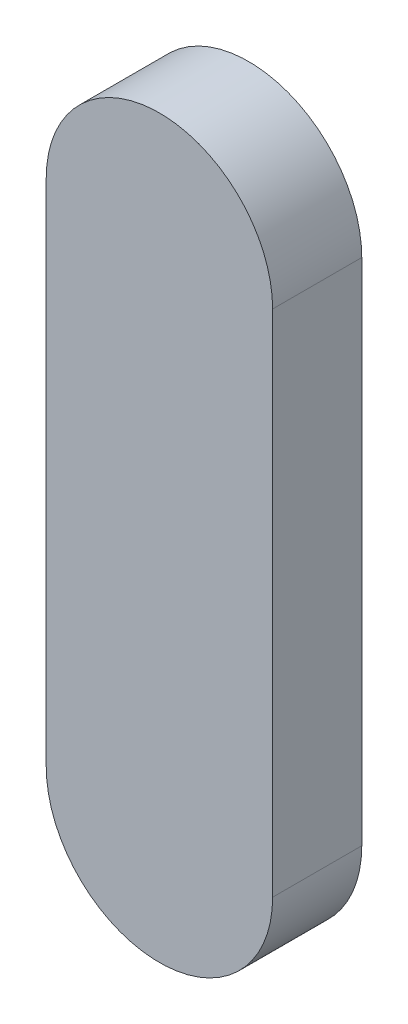
ISO-10303-21;
HEADER;
FILE_DESCRIPTION(('STEP AP214'),'2;1');
FILE_NAME('part.step','',(''),(''),'','','');
FILE_SCHEMA(('AUTOMOTIVE_DESIGN { 1 0 10303 214 1 1 1 1 }'));
ENDSEC;
DATA;
#1=APPLICATION_CONTEXT('core data for automotive mechanical design processes');
#2=APPLICATION_PROTOCOL_DEFINITION('international standard','automotive_design',2000,#1);
#3=PRODUCT_CONTEXT('',#1,'mechanical');
#4=PRODUCT('Part','Part','',(#3));
#5=PRODUCT_RELATED_PRODUCT_CATEGORY('part','',(#4));
#6=PRODUCT_DEFINITION_FORMATION('','',#4);
#7=PRODUCT_DEFINITION_CONTEXT('part definition',#1,'design');
#8=PRODUCT_DEFINITION('design','',#6,#7);
#9=PRODUCT_DEFINITION_SHAPE('','',#8);
#10=(LENGTH_UNIT() NAMED_UNIT(*) SI_UNIT(.MILLI.,.METRE.));
#11=(NAMED_UNIT(*) PLANE_ANGLE_UNIT() SI_UNIT($,.RADIAN.));
#12=(NAMED_UNIT(*) SI_UNIT($,.STERADIAN.) SOLID_ANGLE_UNIT());
#13=UNCERTAINTY_MEASURE_WITH_UNIT(LENGTH_MEASURE(1.E-05),#10,'distance_accuracy_value','');
#14=(GEOMETRIC_REPRESENTATION_CONTEXT(3) GLOBAL_UNCERTAINTY_ASSIGNED_CONTEXT((#13)) GLOBAL_UNIT_ASSIGNED_CONTEXT((#10,
#11,#12)) REPRESENTATION_CONTEXT('',''));
#15=CARTESIAN_POINT('',(0.,0.,0.));
#16=DIRECTION('',(0.,0.,1.));
#17=DIRECTION('',(1.,0.,0.));
#18=AXIS2_PLACEMENT_3D('',#15,#16,#17);
#19=CARTESIAN_POINT('',(138.684,54.864,0.));
#20=DIRECTION('',(-1.,0.,0.));
#21=DIRECTION('',(0.,1.,0.));
#22=AXIS2_PLACEMENT_3D('',#19,#20,#21);
#23=PLANE('',#22);
#24=DIRECTION('',(0.,1.,0.));
#25=VECTOR('',#24,1.);
#26=CARTESIAN_POINT('',(138.684,54.864,0.1999996));
#27=LINE('',#26,#25);
#28=CARTESIAN_POINT('',(138.684,54.864,0.1999996));
#29=VERTEX_POINT('',#28);
#30=CARTESIAN_POINT('',(138.684,56.007,0.1999996));
#31=VERTEX_POINT('',#30);
#32=EDGE_CURVE('E11',#29,#31,#27,.T.);
#33=ORIENTED_EDGE('',*,*,#32,.F.);
#34=DIRECTION('',(0.,0.,1.));
#35=VECTOR('',#34,1.);
#36=CARTESIAN_POINT('',(138.684,54.864,0.));
#37=LINE('',#36,#35);
#38=CARTESIAN_POINT('',(138.684,54.864,0.));
#39=VERTEX_POINT('',#38);
#40=EDGE_CURVE('E24',#39,#29,#37,.T.);
#41=ORIENTED_EDGE('',*,*,#40,.F.);
#42=DIRECTION('',(0.,1.,0.));
#43=VECTOR('',#42,1.);
#44=CARTESIAN_POINT('',(138.684,54.864,0.));
#45=LINE('',#44,#43);
#46=CARTESIAN_POINT('',(138.684,56.007,0.));
#47=VERTEX_POINT('',#46);
#48=EDGE_CURVE('E75',#39,#47,#45,.T.);
#49=ORIENTED_EDGE('',*,*,#48,.T.);
#50=DIRECTION('',(0.,0.,1.));
#51=VECTOR('',#50,1.);
#52=CARTESIAN_POINT('',(138.684,56.007,0.));
#53=LINE('',#52,#51);
#54=EDGE_CURVE('E37',#47,#31,#53,.T.);
#55=ORIENTED_EDGE('',*,*,#54,.T.);
#56=EDGE_LOOP('',(#33,#41,#49,#55));
#57=FACE_BOUND('',#56,.T.);
#58=ADVANCED_FACE('F17',(#57),#23,.F.);
#59=CARTESIAN_POINT('',(138.43,56.007,0.));
#60=DIRECTION('',(0.,0.,-1.));
#61=DIRECTION('',(1.,0.,0.));
#62=AXIS2_PLACEMENT_3D('',#59,#60,#61);
#63=CYLINDRICAL_SURFACE('',#62,0.254000000000007);
#64=CARTESIAN_POINT('',(138.43,56.007,0.1999996));
#65=DIRECTION('',(0.,0.,1.));
#66=DIRECTION('',(1.,0.,0.));
#67=AXIS2_PLACEMENT_3D('',#64,#65,#66);
#68=CIRCLE('',#67,0.254000000000007);
#69=CARTESIAN_POINT('',(138.176,56.007,0.1999996));
#70=VERTEX_POINT('',#69);
#71=EDGE_CURVE('E83',#31,#70,#68,.T.);
#72=ORIENTED_EDGE('',*,*,#71,.F.);
#73=ORIENTED_EDGE('',*,*,#54,.F.);
#74=CARTESIAN_POINT('',(138.43,56.007,0.));
#75=DIRECTION('',(0.,0.,1.));
#76=DIRECTION('',(1.,0.,0.));
#77=AXIS2_PLACEMENT_3D('',#74,#75,#76);
#78=CIRCLE('',#77,0.254000000000007);
#79=CARTESIAN_POINT('',(138.176,56.007,0.));
#80=VERTEX_POINT('',#79);
#81=EDGE_CURVE('E81',#47,#80,#78,.T.);
#82=ORIENTED_EDGE('',*,*,#81,.T.);
#83=DIRECTION('',(0.,0.,1.));
#84=VECTOR('',#83,1.);
#85=CARTESIAN_POINT('',(138.176,56.007,0.));
#86=LINE('',#85,#84);
#87=EDGE_CURVE('E67',#80,#70,#86,.T.);
#88=ORIENTED_EDGE('',*,*,#87,.T.);
#89=EDGE_LOOP('',(#72,#73,#82,#88));
#90=FACE_BOUND('',#89,.T.);
#91=ADVANCED_FACE('F89',(#90),#63,.T.);
#92=CARTESIAN_POINT('',(138.176,56.007,0.));
#93=DIRECTION('',(1.,0.,0.));
#94=DIRECTION('',(0.,-1.,0.));
#95=AXIS2_PLACEMENT_3D('',#92,#93,#94);
#96=PLANE('',#95);
#97=DIRECTION('',(0.,-1.,0.));
#98=VECTOR('',#97,1.);
#99=CARTESIAN_POINT('',(138.176,56.007,0.1999996));
#100=LINE('',#99,#98);
#101=CARTESIAN_POINT('',(138.176,54.864,0.1999996));
#102=VERTEX_POINT('',#101);
#103=EDGE_CURVE('E71',#70,#102,#100,.T.);
#104=ORIENTED_EDGE('',*,*,#103,.F.);
#105=ORIENTED_EDGE('',*,*,#87,.F.);
#106=DIRECTION('',(0.,-1.,0.));
#107=VECTOR('',#106,1.);
#108=CARTESIAN_POINT('',(138.176,56.007,0.));
#109=LINE('',#108,#107);
#110=CARTESIAN_POINT('',(138.176,54.864,0.));
#111=VERTEX_POINT('',#110);
#112=EDGE_CURVE('E63',#80,#111,#109,.T.);
#113=ORIENTED_EDGE('',*,*,#112,.T.);
#114=DIRECTION('',(0.,0.,1.));
#115=VECTOR('',#114,1.);
#116=CARTESIAN_POINT('',(138.176,54.864,0.));
#117=LINE('',#116,#115);
#118=EDGE_CURVE('E53',#111,#102,#117,.T.);
#119=ORIENTED_EDGE('',*,*,#118,.T.);
#120=EDGE_LOOP('',(#104,#105,#113,#119));
#121=FACE_BOUND('',#120,.T.);
#122=ADVANCED_FACE('F66',(#121),#96,.F.);
#123=CARTESIAN_POINT('',(138.43,54.864,0.));
#124=DIRECTION('',(0.,0.,-1.));
#125=DIRECTION('',(-1.,0.,0.));
#126=AXIS2_PLACEMENT_3D('',#123,#124,#125);
#127=CYLINDRICAL_SURFACE('',#126,0.254000000000005);
#128=CARTESIAN_POINT('',(138.43,54.864,0.1999996));
#129=DIRECTION('',(0.,0.,1.));
#130=DIRECTION('',(-1.,0.,0.));
#131=AXIS2_PLACEMENT_3D('',#128,#129,#130);
#132=CIRCLE('',#131,0.254000000000005);
#133=EDGE_CURVE('E59',#102,#29,#132,.T.);
#134=ORIENTED_EDGE('',*,*,#133,.F.);
#135=ORIENTED_EDGE('',*,*,#118,.F.);
#136=CARTESIAN_POINT('',(138.43,54.864,0.));
#137=DIRECTION('',(0.,0.,1.));
#138=DIRECTION('',(-1.,0.,0.));
#139=AXIS2_PLACEMENT_3D('',#136,#137,#138);
#140=CIRCLE('',#139,0.254000000000005);
#141=EDGE_CURVE('E57',#111,#39,#140,.T.);
#142=ORIENTED_EDGE('',*,*,#141,.T.);
#143=ORIENTED_EDGE('',*,*,#40,.T.);
#144=EDGE_LOOP('',(#134,#135,#142,#143));
#145=FACE_BOUND('',#144,.T.);
#146=ADVANCED_FACE('F55',(#145),#127,.T.);
#147=CARTESIAN_POINT('',(138.684,54.864,0.));
#148=DIRECTION('',(0.,0.,-1.));
#149=DIRECTION('',(-1.,0.,0.));
#150=AXIS2_PLACEMENT_3D('',#147,#148,#149);
#151=PLANE('',#150);
#152=ORIENTED_EDGE('',*,*,#141,.F.);
#153=ORIENTED_EDGE('',*,*,#112,.F.);
#154=ORIENTED_EDGE('',*,*,#81,.F.);
#155=ORIENTED_EDGE('',*,*,#48,.F.);
#156=EDGE_LOOP('',(#152,#153,#154,#155));
#157=FACE_BOUND('',#156,.T.);
#158=ADVANCED_FACE('F74',(#157),#151,.T.);
#159=CARTESIAN_POINT('',(138.684,54.864,0.1999996));
#160=DIRECTION('',(0.,0.,-1.));
#161=DIRECTION('',(-1.,0.,0.));
#162=AXIS2_PLACEMENT_3D('',#159,#160,#161);
#163=PLANE('',#162);
#164=ORIENTED_EDGE('',*,*,#32,.T.);
#165=ORIENTED_EDGE('',*,*,#71,.T.);
#166=ORIENTED_EDGE('',*,*,#103,.T.);
#167=ORIENTED_EDGE('',*,*,#133,.T.);
#168=EDGE_LOOP('',(#164,#165,#166,#167));
#169=FACE_BOUND('',#168,.T.);
#170=ADVANCED_FACE('F91',(#169),#163,.F.);
#171=CLOSED_SHELL('',(#58,#91,#122,#146,#158,#170));
#172=MANIFOLD_SOLID_BREP('B1',#171);
#173=ADVANCED_BREP_SHAPE_REPRESENTATION('',(#18,#172),#14);
#174=SHAPE_DEFINITION_REPRESENTATION(#9,#173);
ENDSEC;
END-ISO-10303-21;
